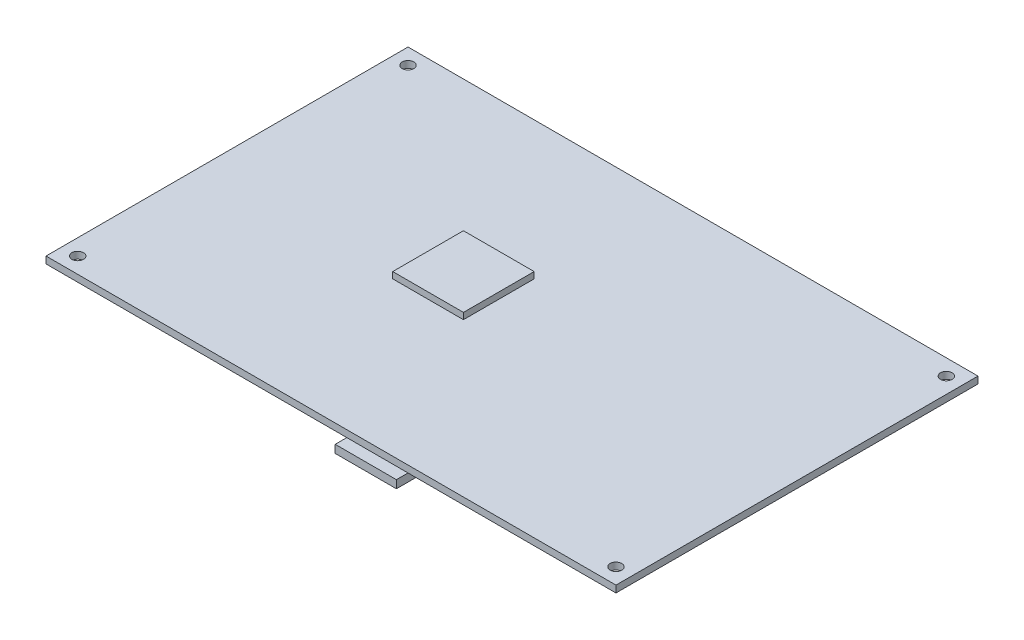
ISO-10303-21;
HEADER;
FILE_DESCRIPTION(('STEP AP214'),'2;1');
FILE_NAME('part.step','',(''),(''),'','','');
FILE_SCHEMA(('AUTOMOTIVE_DESIGN { 1 0 10303 214 1 1 1 1 }'));
ENDSEC;
DATA;
#1=APPLICATION_CONTEXT('core data for automotive mechanical design processes');
#2=APPLICATION_PROTOCOL_DEFINITION('international standard','automotive_design',2000,#1);
#3=PRODUCT_CONTEXT('',#1,'mechanical');
#4=PRODUCT('Part','Part','',(#3));
#5=PRODUCT_RELATED_PRODUCT_CATEGORY('part','',(#4));
#6=PRODUCT_DEFINITION_FORMATION('','',#4);
#7=PRODUCT_DEFINITION_CONTEXT('part definition',#1,'design');
#8=PRODUCT_DEFINITION('design','',#6,#7);
#9=PRODUCT_DEFINITION_SHAPE('','',#8);
#10=(LENGTH_UNIT() NAMED_UNIT(*) SI_UNIT(.MILLI.,.METRE.));
#11=(NAMED_UNIT(*) PLANE_ANGLE_UNIT() SI_UNIT($,.RADIAN.));
#12=(NAMED_UNIT(*) SI_UNIT($,.STERADIAN.) SOLID_ANGLE_UNIT());
#13=UNCERTAINTY_MEASURE_WITH_UNIT(LENGTH_MEASURE(1.E-05),#10,'distance_accuracy_value','');
#14=(GEOMETRIC_REPRESENTATION_CONTEXT(3) GLOBAL_UNCERTAINTY_ASSIGNED_CONTEXT((#13)) GLOBAL_UNIT_ASSIGNED_CONTEXT((#10,
#11,#12)) REPRESENTATION_CONTEXT('',''));
#15=CARTESIAN_POINT('',(0.,0.,0.));
#16=DIRECTION('',(0.,0.,1.));
#17=DIRECTION('',(1.,0.,0.));
#18=AXIS2_PLACEMENT_3D('',#15,#16,#17);
#19=CARTESIAN_POINT('',(0.,1.651,0.));
#20=DIRECTION('',(0.,1.,0.));
#21=DIRECTION('',(0.,0.,1.));
#22=AXIS2_PLACEMENT_3D('',#19,#20,#21);
#23=PLANE('',#22);
#24=CARTESIAN_POINT('',(-3.81,1.651,-83.312));
#25=DIRECTION('',(0.,1.,0.));
#26=DIRECTION('',(0.,0.,1.));
#27=AXIS2_PLACEMENT_3D('',#24,#25,#26);
#28=CIRCLE('',#27,1.39700000000001);
#29=CARTESIAN_POINT('',(-3.81,1.651,-84.709));
#30=VERTEX_POINT('',#29);
#31=EDGE_CURVE('E219',#30,#30,#28,.T.);
#32=ORIENTED_EDGE('',*,*,#31,.F.);
#33=EDGE_LOOP('',(#32));
#34=FACE_BOUND('',#33,.T.);
#35=CARTESIAN_POINT('',(-133.35,1.651,-83.312));
#36=DIRECTION('',(0.,1.,0.));
#37=DIRECTION('',(0.,0.,1.));
#38=AXIS2_PLACEMENT_3D('',#35,#36,#37);
#39=CIRCLE('',#38,1.39700000000002);
#40=CARTESIAN_POINT('',(-133.35,1.651,-84.709));
#41=VERTEX_POINT('',#40);
#42=EDGE_CURVE('E235',#41,#41,#39,.T.);
#43=ORIENTED_EDGE('',*,*,#42,.F.);
#44=EDGE_LOOP('',(#43));
#45=FACE_BOUND('',#44,.T.);
#46=DIRECTION('',(0.,0.,-1.));
#47=VECTOR('',#46,1.);
#48=CARTESIAN_POINT('',(0.,1.651,0.));
#49=LINE('',#48,#47);
#50=CARTESIAN_POINT('',(0.,1.651,0.));
#51=VERTEX_POINT('',#50);
#52=CARTESIAN_POINT('',(0.,1.651,-87.122));
#53=VERTEX_POINT('',#52);
#54=EDGE_CURVE('E243',#51,#53,#49,.T.);
#55=ORIENTED_EDGE('',*,*,#54,.T.);
#56=DIRECTION('',(-1.,0.,0.));
#57=VECTOR('',#56,1.);
#58=CARTESIAN_POINT('',(0.,1.651,-87.122));
#59=LINE('',#58,#57);
#60=CARTESIAN_POINT('',(-137.16,1.651,-87.122));
#61=VERTEX_POINT('',#60);
#62=EDGE_CURVE('E247',#53,#61,#59,.T.);
#63=ORIENTED_EDGE('',*,*,#62,.T.);
#64=DIRECTION('',(0.,0.,1.));
#65=VECTOR('',#64,1.);
#66=CARTESIAN_POINT('',(-137.16,1.651,0.));
#67=LINE('',#66,#65);
#68=CARTESIAN_POINT('',(-137.16,1.651,0.));
#69=VERTEX_POINT('',#68);
#70=EDGE_CURVE('E251',#61,#69,#67,.T.);
#71=ORIENTED_EDGE('',*,*,#70,.T.);
#72=DIRECTION('',(1.,0.,0.));
#73=VECTOR('',#72,1.);
#74=CARTESIAN_POINT('',(0.,1.651,0.));
#75=LINE('',#74,#73);
#76=EDGE_CURVE('E254',#69,#51,#75,.T.);
#77=ORIENTED_EDGE('',*,*,#76,.T.);
#78=EDGE_LOOP('',(#55,#63,#71,#77));
#79=FACE_BOUND('',#78,.T.);
#80=CARTESIAN_POINT('',(-3.81,1.651,-3.81));
#81=DIRECTION('',(0.,1.,0.));
#82=DIRECTION('',(0.,0.,1.));
#83=AXIS2_PLACEMENT_3D('',#80,#81,#82);
#84=CIRCLE('',#83,1.397);
#85=CARTESIAN_POINT('',(-3.81,1.651,-5.207));
#86=VERTEX_POINT('',#85);
#87=EDGE_CURVE('E227',#86,#86,#84,.T.);
#88=ORIENTED_EDGE('',*,*,#87,.F.);
#89=EDGE_LOOP('',(#88));
#90=FACE_BOUND('',#89,.T.);
#91=CARTESIAN_POINT('',(-133.35,1.651,-3.80999999999998));
#92=DIRECTION('',(0.,1.,0.));
#93=DIRECTION('',(0.,0.,1.));
#94=AXIS2_PLACEMENT_3D('',#91,#92,#93);
#95=CIRCLE('',#94,1.39699999999999);
#96=CARTESIAN_POINT('',(-133.35,1.651,-5.20699999999997));
#97=VERTEX_POINT('',#96);
#98=EDGE_CURVE('E211',#97,#97,#95,.T.);
#99=ORIENTED_EDGE('',*,*,#98,.F.);
#100=EDGE_LOOP('',(#99));
#101=FACE_BOUND('',#100,.T.);
#102=DIRECTION('',(1.,0.,0.));
#103=VECTOR('',#102,1.);
#104=CARTESIAN_POINT('',(-90.678,1.651,-36.957));
#105=LINE('',#104,#103);
#106=CARTESIAN_POINT('',(-90.678,1.651,-36.957));
#107=VERTEX_POINT('',#106);
#108=CARTESIAN_POINT('',(-73.66,1.651,-36.957));
#109=VERTEX_POINT('',#108);
#110=EDGE_CURVE('E313',#107,#109,#105,.T.);
#111=ORIENTED_EDGE('',*,*,#110,.F.);
#112=DIRECTION('',(0.,0.,1.));
#113=VECTOR('',#112,1.);
#114=CARTESIAN_POINT('',(-90.678,1.651,-36.957));
#115=LINE('',#114,#113);
#116=CARTESIAN_POINT('',(-90.678,1.651,-53.975));
#117=VERTEX_POINT('',#116);
#118=EDGE_CURVE('E161',#117,#107,#115,.T.);
#119=ORIENTED_EDGE('',*,*,#118,.F.);
#120=DIRECTION('',(-1.,0.,0.));
#121=VECTOR('',#120,1.);
#122=CARTESIAN_POINT('',(-90.678,1.651,-53.975));
#123=LINE('',#122,#121);
#124=CARTESIAN_POINT('',(-73.66,1.651,-53.975));
#125=VERTEX_POINT('',#124);
#126=EDGE_CURVE('E157',#125,#117,#123,.T.);
#127=ORIENTED_EDGE('',*,*,#126,.F.);
#128=DIRECTION('',(0.,0.,-1.));
#129=VECTOR('',#128,1.);
#130=CARTESIAN_POINT('',(-73.66,1.651,-36.957));
#131=LINE('',#130,#129);
#132=EDGE_CURVE('E315',#109,#125,#131,.T.);
#133=ORIENTED_EDGE('',*,*,#132,.F.);
#134=EDGE_LOOP('',(#111,#119,#127,#133));
#135=FACE_BOUND('',#134,.T.);
#136=ADVANCED_FACE('F39',(#34,#45,#79,#90,#101,#135),#23,.T.);
#137=CARTESIAN_POINT('',(0.,0.,0.));
#138=DIRECTION('',(0.,1.,0.));
#139=DIRECTION('',(0.,0.,1.));
#140=AXIS2_PLACEMENT_3D('',#137,#138,#139);
#141=PLANE('',#140);
#142=CARTESIAN_POINT('',(-133.35,0.,-3.80999999999998));
#143=DIRECTION('',(0.,1.,0.));
#144=DIRECTION('',(0.,0.,1.));
#145=AXIS2_PLACEMENT_3D('',#142,#143,#144);
#146=CIRCLE('',#145,1.39699999999999);
#147=CARTESIAN_POINT('',(-133.35,0.,-5.20699999999997));
#148=VERTEX_POINT('',#147);
#149=EDGE_CURVE('E210',#148,#148,#146,.T.);
#150=ORIENTED_EDGE('',*,*,#149,.T.);
#151=EDGE_LOOP('',(#150));
#152=FACE_BOUND('',#151,.T.);
#153=CARTESIAN_POINT('',(-3.81,0.,-83.312));
#154=DIRECTION('',(0.,1.,0.));
#155=DIRECTION('',(0.,0.,1.));
#156=AXIS2_PLACEMENT_3D('',#153,#154,#155);
#157=CIRCLE('',#156,1.39700000000001);
#158=CARTESIAN_POINT('',(-3.81,0.,-84.709));
#159=VERTEX_POINT('',#158);
#160=EDGE_CURVE('E215',#159,#159,#157,.T.);
#161=ORIENTED_EDGE('',*,*,#160,.T.);
#162=EDGE_LOOP('',(#161));
#163=FACE_BOUND('',#162,.T.);
#164=CARTESIAN_POINT('',(-3.81,0.,-3.81));
#165=DIRECTION('',(0.,1.,0.));
#166=DIRECTION('',(0.,0.,1.));
#167=AXIS2_PLACEMENT_3D('',#164,#165,#166);
#168=CIRCLE('',#167,1.397);
#169=CARTESIAN_POINT('',(-3.81,0.,-5.207));
#170=VERTEX_POINT('',#169);
#171=EDGE_CURVE('E223',#170,#170,#168,.T.);
#172=ORIENTED_EDGE('',*,*,#171,.T.);
#173=EDGE_LOOP('',(#172));
#174=FACE_BOUND('',#173,.T.);
#175=CARTESIAN_POINT('',(-133.35,0.,-83.312));
#176=DIRECTION('',(0.,1.,0.));
#177=DIRECTION('',(0.,0.,1.));
#178=AXIS2_PLACEMENT_3D('',#175,#176,#177);
#179=CIRCLE('',#178,1.39700000000002);
#180=CARTESIAN_POINT('',(-133.35,0.,-84.709));
#181=VERTEX_POINT('',#180);
#182=EDGE_CURVE('E231',#181,#181,#179,.T.);
#183=ORIENTED_EDGE('',*,*,#182,.T.);
#184=EDGE_LOOP('',(#183));
#185=FACE_BOUND('',#184,.T.);
#186=DIRECTION('',(0.,0.,-1.));
#187=VECTOR('',#186,1.);
#188=CARTESIAN_POINT('',(-64.77,0.,-11.7348));
#189=LINE('',#188,#187);
#190=CARTESIAN_POINT('',(-64.77,0.,0.));
#191=VERTEX_POINT('',#190);
#192=CARTESIAN_POINT('',(-64.77,0.,-11.7348));
#193=VERTEX_POINT('',#192);
#194=EDGE_CURVE('E11',#191,#193,#189,.T.);
#195=ORIENTED_EDGE('',*,*,#194,.F.);
#196=DIRECTION('',(1.,0.,0.));
#197=VECTOR('',#196,1.);
#198=CARTESIAN_POINT('',(0.,0.,0.));
#199=LINE('',#198,#197);
#200=CARTESIAN_POINT('',(-137.16,0.,0.));
#201=VERTEX_POINT('',#200);
#202=EDGE_CURVE('E248',#201,#191,#199,.T.);
#203=ORIENTED_EDGE('',*,*,#202,.F.);
#204=DIRECTION('',(0.,0.,1.));
#205=VECTOR('',#204,1.);
#206=CARTESIAN_POINT('',(-137.16,0.,0.));
#207=LINE('',#206,#205);
#208=CARTESIAN_POINT('',(-137.16,0.,-87.122));
#209=VERTEX_POINT('',#208);
#210=EDGE_CURVE('E264',#209,#201,#207,.T.);
#211=ORIENTED_EDGE('',*,*,#210,.F.);
#212=DIRECTION('',(-1.,0.,0.));
#213=VECTOR('',#212,1.);
#214=CARTESIAN_POINT('',(0.,0.,-87.122));
#215=LINE('',#214,#213);
#216=CARTESIAN_POINT('',(0.,0.,-87.122));
#217=VERTEX_POINT('',#216);
#218=EDGE_CURVE('E261',#217,#209,#215,.T.);
#219=ORIENTED_EDGE('',*,*,#218,.F.);
#220=DIRECTION('',(0.,0.,-1.));
#221=VECTOR('',#220,1.);
#222=CARTESIAN_POINT('',(0.,0.,0.));
#223=LINE('',#222,#221);
#224=CARTESIAN_POINT('',(0.,0.,0.));
#225=VERTEX_POINT('',#224);
#226=EDGE_CURVE('E239',#225,#217,#223,.T.);
#227=ORIENTED_EDGE('',*,*,#226,.F.);
#228=CARTESIAN_POINT('',(-50.038,0.,0.));
#229=VERTEX_POINT('',#228);
#230=EDGE_CURVE('E267',#229,#225,#199,.T.);
#231=ORIENTED_EDGE('',*,*,#230,.F.);
#232=DIRECTION('',(0.,0.,1.));
#233=VECTOR('',#232,1.);
#234=CARTESIAN_POINT('',(-50.038,0.,-11.7348));
#235=LINE('',#234,#233);
#236=CARTESIAN_POINT('',(-50.038,0.,-11.7348));
#237=VERTEX_POINT('',#236);
#238=EDGE_CURVE('E189',#237,#229,#235,.T.);
#239=ORIENTED_EDGE('',*,*,#238,.F.);
#240=DIRECTION('',(1.,0.,0.));
#241=VECTOR('',#240,1.);
#242=CARTESIAN_POINT('',(-64.77,0.,-11.7348));
#243=LINE('',#242,#241);
#244=EDGE_CURVE('E65',#193,#237,#243,.T.);
#245=ORIENTED_EDGE('',*,*,#244,.F.);
#246=EDGE_LOOP('',(#195,#203,#211,#219,#227,#231,#239,#245));
#247=FACE_BOUND('',#246,.T.);
#248=ADVANCED_FACE('F294',(#152,#163,#174,#185,#247),#141,.F.);
#249=CARTESIAN_POINT('',(0.,1.651,0.));
#250=DIRECTION('',(-1.,0.,0.));
#251=DIRECTION('',(0.,0.,1.));
#252=AXIS2_PLACEMENT_3D('',#249,#250,#251);
#253=PLANE('',#252);
#254=ORIENTED_EDGE('',*,*,#226,.T.);
#255=DIRECTION('',(0.,-1.,0.));
#256=VECTOR('',#255,1.);
#257=CARTESIAN_POINT('',(0.,1.651,-87.122));
#258=LINE('',#257,#256);
#259=EDGE_CURVE('E43',#53,#217,#258,.T.);
#260=ORIENTED_EDGE('',*,*,#259,.F.);
#261=ORIENTED_EDGE('',*,*,#54,.F.);
#262=DIRECTION('',(0.,-1.,0.));
#263=VECTOR('',#262,1.);
#264=CARTESIAN_POINT('',(0.,1.651,0.));
#265=LINE('',#264,#263);
#266=EDGE_CURVE('E257',#51,#225,#265,.T.);
#267=ORIENTED_EDGE('',*,*,#266,.T.);
#268=EDGE_LOOP('',(#254,#260,#261,#267));
#269=FACE_BOUND('',#268,.T.);
#270=ADVANCED_FACE('F41',(#269),#253,.F.);
#271=CARTESIAN_POINT('',(0.,1.651,-87.122));
#272=DIRECTION('',(0.,0.,1.));
#273=DIRECTION('',(1.,0.,0.));
#274=AXIS2_PLACEMENT_3D('',#271,#272,#273);
#275=PLANE('',#274);
#276=ORIENTED_EDGE('',*,*,#218,.T.);
#277=DIRECTION('',(0.,-1.,0.));
#278=VECTOR('',#277,1.);
#279=CARTESIAN_POINT('',(-137.16,1.651,-87.122));
#280=LINE('',#279,#278);
#281=EDGE_CURVE('E278',#61,#209,#280,.T.);
#282=ORIENTED_EDGE('',*,*,#281,.F.);
#283=ORIENTED_EDGE('',*,*,#62,.F.);
#284=ORIENTED_EDGE('',*,*,#259,.T.);
#285=EDGE_LOOP('',(#276,#282,#283,#284));
#286=FACE_BOUND('',#285,.T.);
#287=ADVANCED_FACE('F289',(#286),#275,.F.);
#288=CARTESIAN_POINT('',(-137.16,1.651,0.));
#289=DIRECTION('',(1.,0.,0.));
#290=DIRECTION('',(0.,0.,-1.));
#291=AXIS2_PLACEMENT_3D('',#288,#289,#290);
#292=PLANE('',#291);
#293=ORIENTED_EDGE('',*,*,#210,.T.);
#294=DIRECTION('',(0.,-1.,0.));
#295=VECTOR('',#294,1.);
#296=CARTESIAN_POINT('',(-137.16,1.651,0.));
#297=LINE('',#296,#295);
#298=EDGE_CURVE('E275',#69,#201,#297,.T.);
#299=ORIENTED_EDGE('',*,*,#298,.F.);
#300=ORIENTED_EDGE('',*,*,#70,.F.);
#301=ORIENTED_EDGE('',*,*,#281,.T.);
#302=EDGE_LOOP('',(#293,#299,#300,#301));
#303=FACE_BOUND('',#302,.T.);
#304=ADVANCED_FACE('F298',(#303),#292,.F.);
#305=CARTESIAN_POINT('',(0.,1.651,0.));
#306=DIRECTION('',(0.,0.,-1.));
#307=DIRECTION('',(-1.,0.,0.));
#308=AXIS2_PLACEMENT_3D('',#305,#306,#307);
#309=PLANE('',#308);
#310=ORIENTED_EDGE('',*,*,#202,.T.);
#311=EDGE_CURVE('E271',#191,#229,#199,.T.);
#312=ORIENTED_EDGE('',*,*,#311,.T.);
#313=ORIENTED_EDGE('',*,*,#230,.T.);
#314=ORIENTED_EDGE('',*,*,#266,.F.);
#315=ORIENTED_EDGE('',*,*,#76,.F.);
#316=ORIENTED_EDGE('',*,*,#298,.T.);
#317=EDGE_LOOP('',(#310,#312,#313,#314,#315,#316));
#318=FACE_BOUND('',#317,.T.);
#319=ADVANCED_FACE('F301',(#318),#309,.F.);
#320=CARTESIAN_POINT('',(-133.35,1.651,-83.312));
#321=DIRECTION('',(0.,-1.,0.));
#322=DIRECTION('',(0.,0.,-1.));
#323=AXIS2_PLACEMENT_3D('',#320,#321,#322);
#324=CYLINDRICAL_SURFACE('',#323,1.39700000000002);
#325=CARTESIAN_POINT('',(-133.35,1.651,-84.709));
#326=CARTESIAN_POINT('',(-133.35,1.63380208333333,-84.709));
#327=CARTESIAN_POINT('',(-133.35,1.61660416666667,-84.709));
#328=CARTESIAN_POINT('',(-133.35,1.58220833333333,-84.709));
#329=CARTESIAN_POINT('',(-133.35,1.56501041666667,-84.709));
#330=CARTESIAN_POINT('',(-133.35,1.53061458333333,-84.709));
#331=CARTESIAN_POINT('',(-133.35,1.51341666666667,-84.709));
#332=CARTESIAN_POINT('',(-133.35,1.47902083333333,-84.709));
#333=CARTESIAN_POINT('',(-133.35,1.46182291666667,-84.709));
#334=CARTESIAN_POINT('',(-133.35,1.42742708333333,-84.709));
#335=CARTESIAN_POINT('',(-133.35,1.41022916666667,-84.709));
#336=CARTESIAN_POINT('',(-133.35,1.37583333333333,-84.709));
#337=CARTESIAN_POINT('',(-133.35,1.35863541666667,-84.709));
#338=CARTESIAN_POINT('',(-133.35,1.32423958333333,-84.709));
#339=CARTESIAN_POINT('',(-133.35,1.30704166666667,-84.709));
#340=CARTESIAN_POINT('',(-133.35,1.27264583333333,-84.709));
#341=CARTESIAN_POINT('',(-133.35,1.25544791666667,-84.709));
#342=CARTESIAN_POINT('',(-133.35,1.22105208333333,-84.709));
#343=CARTESIAN_POINT('',(-133.35,1.20385416666667,-84.709));
#344=CARTESIAN_POINT('',(-133.35,1.16945833333333,-84.709));
#345=CARTESIAN_POINT('',(-133.35,1.15226041666667,-84.709));
#346=CARTESIAN_POINT('',(-133.35,1.11786458333333,-84.709));
#347=CARTESIAN_POINT('',(-133.35,1.10066666666667,-84.709));
#348=CARTESIAN_POINT('',(-133.35,1.06627083333333,-84.709));
#349=CARTESIAN_POINT('',(-133.35,1.04907291666667,-84.709));
#350=CARTESIAN_POINT('',(-133.35,1.01467708333333,-84.709));
#351=CARTESIAN_POINT('',(-133.35,0.997479166666666,-84.709));
#352=CARTESIAN_POINT('',(-133.35,0.963083333333333,-84.709));
#353=CARTESIAN_POINT('',(-133.35,0.945885416666667,-84.709));
#354=CARTESIAN_POINT('',(-133.35,0.911489583333333,-84.709));
#355=CARTESIAN_POINT('',(-133.35,0.894291666666667,-84.709));
#356=CARTESIAN_POINT('',(-133.35,0.859895833333333,-84.709));
#357=CARTESIAN_POINT('',(-133.35,0.842697916666667,-84.709));
#358=CARTESIAN_POINT('',(-133.35,0.808302083333333,-84.709));
#359=CARTESIAN_POINT('',(-133.35,0.791104166666667,-84.709));
#360=CARTESIAN_POINT('',(-133.35,0.756708333333333,-84.709));
#361=CARTESIAN_POINT('',(-133.35,0.739510416666667,-84.709));
#362=CARTESIAN_POINT('',(-133.35,0.705114583333333,-84.709));
#363=CARTESIAN_POINT('',(-133.35,0.687916666666667,-84.709));
#364=CARTESIAN_POINT('',(-133.35,0.653520833333333,-84.709));
#365=CARTESIAN_POINT('',(-133.35,0.636322916666667,-84.709));
#366=CARTESIAN_POINT('',(-133.35,0.601927083333333,-84.709));
#367=CARTESIAN_POINT('',(-133.35,0.584729166666667,-84.709));
#368=CARTESIAN_POINT('',(-133.35,0.550333333333333,-84.709));
#369=CARTESIAN_POINT('',(-133.35,0.533135416666667,-84.709));
#370=CARTESIAN_POINT('',(-133.35,0.498739583333333,-84.709));
#371=CARTESIAN_POINT('',(-133.35,0.481541666666667,-84.709));
#372=CARTESIAN_POINT('',(-133.35,0.447145833333333,-84.709));
#373=CARTESIAN_POINT('',(-133.35,0.429947916666667,-84.709));
#374=CARTESIAN_POINT('',(-133.35,0.395552083333333,-84.709));
#375=CARTESIAN_POINT('',(-133.35,0.378354166666667,-84.709));
#376=CARTESIAN_POINT('',(-133.35,0.343958333333333,-84.709));
#377=CARTESIAN_POINT('',(-133.35,0.326760416666667,-84.709));
#378=CARTESIAN_POINT('',(-133.35,0.292364583333333,-84.709));
#379=CARTESIAN_POINT('',(-133.35,0.275166666666667,-84.709));
#380=CARTESIAN_POINT('',(-133.35,0.240770833333333,-84.709));
#381=CARTESIAN_POINT('',(-133.35,0.223572916666667,-84.709));
#382=CARTESIAN_POINT('',(-133.35,0.189177083333333,-84.709));
#383=CARTESIAN_POINT('',(-133.35,0.171979166666667,-84.709));
#384=CARTESIAN_POINT('',(-133.35,0.137583333333333,-84.709));
#385=CARTESIAN_POINT('',(-133.35,0.120385416666667,-84.709));
#386=CARTESIAN_POINT('',(-133.35,0.0859895833333333,-84.709));
#387=CARTESIAN_POINT('',(-133.35,0.0687916666666667,-84.709));
#388=CARTESIAN_POINT('',(-133.35,0.0343958333333333,-84.709));
#389=CARTESIAN_POINT('',(-133.35,0.0171979166666666,-84.709));
#390=CARTESIAN_POINT('',(-133.35,0.,-84.709));
#391=B_SPLINE_CURVE_WITH_KNOTS('',3,(#325,#326,#327,#328,#329,#330,#331,#332,#333,#334,#335,
#336,#337,#338,#339,#340,#341,#342,#343,#344,#345,#346,#347,#348,#349,#350,#351,#352,#353,#354,
#355,#356,#357,#358,#359,#360,#361,#362,#363,#364,#365,#366,#367,#368,#369,#370,#371,#372,#373,
#374,#375,#376,#377,#378,#379,#380,#381,#382,#383,#384,#385,#386,#387,#388,#389,#390),
.UNSPECIFIED.,.F.,.F.,(4,2,2,2,2,2,2,2,2,2,2,2,2,2,2,2,2,2,2,2,2,2,2,2,2,2,2,2,2,2,2,2,4),(0.,
0.05159375,0.1031875,0.15478125,0.206375,0.25796875,0.3095625,0.36115625,0.41275,0.46434375,
0.5159375,0.56753125,0.619125,0.67071875,0.7223125,0.77390625,0.8255,0.87709375,0.9286875,
0.98028125,1.031875,1.08346875,1.1350625,1.18665625,1.23825,1.28984375,1.3414375,1.39303125,
1.444625,1.49621875,1.5478125,1.59940625,1.651),.UNSPECIFIED.);
#392=EDGE_CURVE('BSEAM383',#41,#181,#391,.T.);
#393=ORIENTED_EDGE('',*,*,#42,.T.);
#394=ORIENTED_EDGE('',*,*,#182,.F.);
#395=ORIENTED_EDGE('',*,*,#392,.T.);
#396=ORIENTED_EDGE('',*,*,#392,.F.);
#397=EDGE_LOOP('',(#393,#395,#394,#396));
#398=FACE_BOUND('',#397,.T.);
#399=ADVANCED_FACE('F383',(#398),#324,.F.);
#400=CARTESIAN_POINT('',(-3.81,1.651,-3.81));
#401=DIRECTION('',(0.,-1.,0.));
#402=DIRECTION('',(0.,0.,-1.));
#403=AXIS2_PLACEMENT_3D('',#400,#401,#402);
#404=CYLINDRICAL_SURFACE('',#403,1.397);
#405=CARTESIAN_POINT('',(-3.81,1.651,-5.207));
#406=CARTESIAN_POINT('',(-3.81,1.63380208333333,-5.207));
#407=CARTESIAN_POINT('',(-3.81,1.61660416666667,-5.207));
#408=CARTESIAN_POINT('',(-3.81,1.58220833333333,-5.207));
#409=CARTESIAN_POINT('',(-3.81,1.56501041666667,-5.207));
#410=CARTESIAN_POINT('',(-3.81,1.53061458333333,-5.207));
#411=CARTESIAN_POINT('',(-3.81,1.51341666666667,-5.207));
#412=CARTESIAN_POINT('',(-3.81,1.47902083333333,-5.207));
#413=CARTESIAN_POINT('',(-3.81,1.46182291666667,-5.207));
#414=CARTESIAN_POINT('',(-3.81,1.42742708333333,-5.207));
#415=CARTESIAN_POINT('',(-3.81,1.41022916666667,-5.207));
#416=CARTESIAN_POINT('',(-3.81,1.37583333333333,-5.207));
#417=CARTESIAN_POINT('',(-3.81,1.35863541666667,-5.207));
#418=CARTESIAN_POINT('',(-3.81,1.32423958333333,-5.207));
#419=CARTESIAN_POINT('',(-3.81,1.30704166666667,-5.207));
#420=CARTESIAN_POINT('',(-3.81,1.27264583333333,-5.207));
#421=CARTESIAN_POINT('',(-3.81,1.25544791666667,-5.207));
#422=CARTESIAN_POINT('',(-3.81,1.22105208333333,-5.207));
#423=CARTESIAN_POINT('',(-3.81,1.20385416666667,-5.207));
#424=CARTESIAN_POINT('',(-3.81,1.16945833333333,-5.207));
#425=CARTESIAN_POINT('',(-3.81,1.15226041666667,-5.207));
#426=CARTESIAN_POINT('',(-3.81,1.11786458333333,-5.207));
#427=CARTESIAN_POINT('',(-3.81,1.10066666666667,-5.207));
#428=CARTESIAN_POINT('',(-3.81,1.06627083333333,-5.207));
#429=CARTESIAN_POINT('',(-3.81,1.04907291666667,-5.207));
#430=CARTESIAN_POINT('',(-3.81,1.01467708333333,-5.207));
#431=CARTESIAN_POINT('',(-3.81,0.997479166666666,-5.207));
#432=CARTESIAN_POINT('',(-3.81,0.963083333333333,-5.207));
#433=CARTESIAN_POINT('',(-3.81,0.945885416666667,-5.207));
#434=CARTESIAN_POINT('',(-3.81,0.911489583333333,-5.207));
#435=CARTESIAN_POINT('',(-3.81,0.894291666666667,-5.207));
#436=CARTESIAN_POINT('',(-3.81,0.859895833333333,-5.207));
#437=CARTESIAN_POINT('',(-3.81,0.842697916666667,-5.207));
#438=CARTESIAN_POINT('',(-3.81,0.808302083333333,-5.207));
#439=CARTESIAN_POINT('',(-3.81,0.791104166666667,-5.207));
#440=CARTESIAN_POINT('',(-3.81,0.756708333333333,-5.207));
#441=CARTESIAN_POINT('',(-3.81,0.739510416666667,-5.207));
#442=CARTESIAN_POINT('',(-3.81,0.705114583333333,-5.207));
#443=CARTESIAN_POINT('',(-3.81,0.687916666666667,-5.207));
#444=CARTESIAN_POINT('',(-3.81,0.653520833333333,-5.207));
#445=CARTESIAN_POINT('',(-3.81,0.636322916666667,-5.207));
#446=CARTESIAN_POINT('',(-3.81,0.601927083333333,-5.207));
#447=CARTESIAN_POINT('',(-3.81,0.584729166666667,-5.207));
#448=CARTESIAN_POINT('',(-3.81,0.550333333333333,-5.207));
#449=CARTESIAN_POINT('',(-3.81,0.533135416666667,-5.207));
#450=CARTESIAN_POINT('',(-3.81,0.498739583333333,-5.207));
#451=CARTESIAN_POINT('',(-3.81,0.481541666666667,-5.207));
#452=CARTESIAN_POINT('',(-3.81,0.447145833333333,-5.207));
#453=CARTESIAN_POINT('',(-3.81,0.429947916666667,-5.207));
#454=CARTESIAN_POINT('',(-3.81,0.395552083333333,-5.207));
#455=CARTESIAN_POINT('',(-3.81,0.378354166666667,-5.207));
#456=CARTESIAN_POINT('',(-3.81,0.343958333333333,-5.207));
#457=CARTESIAN_POINT('',(-3.81,0.326760416666667,-5.207));
#458=CARTESIAN_POINT('',(-3.81,0.292364583333333,-5.207));
#459=CARTESIAN_POINT('',(-3.81,0.275166666666667,-5.207));
#460=CARTESIAN_POINT('',(-3.81,0.240770833333333,-5.207));
#461=CARTESIAN_POINT('',(-3.81,0.223572916666667,-5.207));
#462=CARTESIAN_POINT('',(-3.81,0.189177083333333,-5.207));
#463=CARTESIAN_POINT('',(-3.81,0.171979166666667,-5.207));
#464=CARTESIAN_POINT('',(-3.81,0.137583333333333,-5.207));
#465=CARTESIAN_POINT('',(-3.81,0.120385416666667,-5.207));
#466=CARTESIAN_POINT('',(-3.81,0.0859895833333333,-5.207));
#467=CARTESIAN_POINT('',(-3.81,0.0687916666666667,-5.207));
#468=CARTESIAN_POINT('',(-3.81,0.0343958333333333,-5.207));
#469=CARTESIAN_POINT('',(-3.81,0.0171979166666666,-5.207));
#470=CARTESIAN_POINT('',(-3.81,0.,-5.207));
#471=B_SPLINE_CURVE_WITH_KNOTS('',3,(#405,#406,#407,#408,#409,#410,#411,#412,#413,#414,#415,
#416,#417,#418,#419,#420,#421,#422,#423,#424,#425,#426,#427,#428,#429,#430,#431,#432,#433,#434,
#435,#436,#437,#438,#439,#440,#441,#442,#443,#444,#445,#446,#447,#448,#449,#450,#451,#452,#453,
#454,#455,#456,#457,#458,#459,#460,#461,#462,#463,#464,#465,#466,#467,#468,#469,#470),
.UNSPECIFIED.,.F.,.F.,(4,2,2,2,2,2,2,2,2,2,2,2,2,2,2,2,2,2,2,2,2,2,2,2,2,2,2,2,2,2,2,2,4),(0.,
0.05159375,0.1031875,0.15478125,0.206375,0.25796875,0.3095625,0.36115625,0.41275,0.46434375,
0.5159375,0.56753125,0.619125,0.67071875,0.7223125,0.77390625,0.8255,0.87709375,0.9286875,
0.98028125,1.031875,1.08346875,1.1350625,1.18665625,1.23825,1.28984375,1.3414375,1.39303125,
1.444625,1.49621875,1.5478125,1.59940625,1.651),.UNSPECIFIED.);
#472=EDGE_CURVE('BSEAM379',#86,#170,#471,.T.);
#473=ORIENTED_EDGE('',*,*,#87,.T.);
#474=ORIENTED_EDGE('',*,*,#171,.F.);
#475=ORIENTED_EDGE('',*,*,#472,.T.);
#476=ORIENTED_EDGE('',*,*,#472,.F.);
#477=EDGE_LOOP('',(#473,#475,#474,#476));
#478=FACE_BOUND('',#477,.T.);
#479=ADVANCED_FACE('F379',(#478),#404,.F.);
#480=CARTESIAN_POINT('',(-3.81,1.651,-83.312));
#481=DIRECTION('',(0.,-1.,0.));
#482=DIRECTION('',(0.,0.,-1.));
#483=AXIS2_PLACEMENT_3D('',#480,#481,#482);
#484=CYLINDRICAL_SURFACE('',#483,1.39700000000001);
#485=CARTESIAN_POINT('',(-3.81,1.651,-84.709));
#486=CARTESIAN_POINT('',(-3.81,1.63380208333333,-84.709));
#487=CARTESIAN_POINT('',(-3.81,1.61660416666667,-84.709));
#488=CARTESIAN_POINT('',(-3.81,1.58220833333333,-84.709));
#489=CARTESIAN_POINT('',(-3.81,1.56501041666667,-84.709));
#490=CARTESIAN_POINT('',(-3.81,1.53061458333333,-84.709));
#491=CARTESIAN_POINT('',(-3.81,1.51341666666667,-84.709));
#492=CARTESIAN_POINT('',(-3.81,1.47902083333333,-84.709));
#493=CARTESIAN_POINT('',(-3.81,1.46182291666667,-84.709));
#494=CARTESIAN_POINT('',(-3.81,1.42742708333333,-84.709));
#495=CARTESIAN_POINT('',(-3.81,1.41022916666667,-84.709));
#496=CARTESIAN_POINT('',(-3.81,1.37583333333333,-84.709));
#497=CARTESIAN_POINT('',(-3.81,1.35863541666667,-84.709));
#498=CARTESIAN_POINT('',(-3.81,1.32423958333333,-84.709));
#499=CARTESIAN_POINT('',(-3.81,1.30704166666667,-84.709));
#500=CARTESIAN_POINT('',(-3.81,1.27264583333333,-84.709));
#501=CARTESIAN_POINT('',(-3.81,1.25544791666667,-84.709));
#502=CARTESIAN_POINT('',(-3.81,1.22105208333333,-84.709));
#503=CARTESIAN_POINT('',(-3.81,1.20385416666667,-84.709));
#504=CARTESIAN_POINT('',(-3.81,1.16945833333333,-84.709));
#505=CARTESIAN_POINT('',(-3.81,1.15226041666667,-84.709));
#506=CARTESIAN_POINT('',(-3.81,1.11786458333333,-84.709));
#507=CARTESIAN_POINT('',(-3.81,1.10066666666667,-84.709));
#508=CARTESIAN_POINT('',(-3.81,1.06627083333333,-84.709));
#509=CARTESIAN_POINT('',(-3.81,1.04907291666667,-84.709));
#510=CARTESIAN_POINT('',(-3.81,1.01467708333333,-84.709));
#511=CARTESIAN_POINT('',(-3.81,0.997479166666666,-84.709));
#512=CARTESIAN_POINT('',(-3.81,0.963083333333333,-84.709));
#513=CARTESIAN_POINT('',(-3.81,0.945885416666667,-84.709));
#514=CARTESIAN_POINT('',(-3.81,0.911489583333333,-84.709));
#515=CARTESIAN_POINT('',(-3.81,0.894291666666667,-84.709));
#516=CARTESIAN_POINT('',(-3.81,0.859895833333333,-84.709));
#517=CARTESIAN_POINT('',(-3.81,0.842697916666667,-84.709));
#518=CARTESIAN_POINT('',(-3.81,0.808302083333333,-84.709));
#519=CARTESIAN_POINT('',(-3.81,0.791104166666667,-84.709));
#520=CARTESIAN_POINT('',(-3.81,0.756708333333333,-84.709));
#521=CARTESIAN_POINT('',(-3.81,0.739510416666667,-84.709));
#522=CARTESIAN_POINT('',(-3.81,0.705114583333333,-84.709));
#523=CARTESIAN_POINT('',(-3.81,0.687916666666667,-84.709));
#524=CARTESIAN_POINT('',(-3.81,0.653520833333333,-84.709));
#525=CARTESIAN_POINT('',(-3.81,0.636322916666667,-84.709));
#526=CARTESIAN_POINT('',(-3.81,0.601927083333333,-84.709));
#527=CARTESIAN_POINT('',(-3.81,0.584729166666667,-84.709));
#528=CARTESIAN_POINT('',(-3.81,0.550333333333333,-84.709));
#529=CARTESIAN_POINT('',(-3.81,0.533135416666667,-84.709));
#530=CARTESIAN_POINT('',(-3.81,0.498739583333333,-84.709));
#531=CARTESIAN_POINT('',(-3.81,0.481541666666667,-84.709));
#532=CARTESIAN_POINT('',(-3.81,0.447145833333333,-84.709));
#533=CARTESIAN_POINT('',(-3.81,0.429947916666667,-84.709));
#534=CARTESIAN_POINT('',(-3.81,0.395552083333333,-84.709));
#535=CARTESIAN_POINT('',(-3.81,0.378354166666667,-84.709));
#536=CARTESIAN_POINT('',(-3.81,0.343958333333333,-84.709));
#537=CARTESIAN_POINT('',(-3.81,0.326760416666667,-84.709));
#538=CARTESIAN_POINT('',(-3.81,0.292364583333333,-84.709));
#539=CARTESIAN_POINT('',(-3.81,0.275166666666667,-84.709));
#540=CARTESIAN_POINT('',(-3.81,0.240770833333333,-84.709));
#541=CARTESIAN_POINT('',(-3.81,0.223572916666667,-84.709));
#542=CARTESIAN_POINT('',(-3.81,0.189177083333333,-84.709));
#543=CARTESIAN_POINT('',(-3.81,0.171979166666667,-84.709));
#544=CARTESIAN_POINT('',(-3.81,0.137583333333333,-84.709));
#545=CARTESIAN_POINT('',(-3.81,0.120385416666667,-84.709));
#546=CARTESIAN_POINT('',(-3.81,0.0859895833333333,-84.709));
#547=CARTESIAN_POINT('',(-3.81,0.0687916666666667,-84.709));
#548=CARTESIAN_POINT('',(-3.81,0.0343958333333333,-84.709));
#549=CARTESIAN_POINT('',(-3.81,0.0171979166666666,-84.709));
#550=CARTESIAN_POINT('',(-3.81,0.,-84.709));
#551=B_SPLINE_CURVE_WITH_KNOTS('',3,(#485,#486,#487,#488,#489,#490,#491,#492,#493,#494,#495,
#496,#497,#498,#499,#500,#501,#502,#503,#504,#505,#506,#507,#508,#509,#510,#511,#512,#513,#514,
#515,#516,#517,#518,#519,#520,#521,#522,#523,#524,#525,#526,#527,#528,#529,#530,#531,#532,#533,
#534,#535,#536,#537,#538,#539,#540,#541,#542,#543,#544,#545,#546,#547,#548,#549,#550),
.UNSPECIFIED.,.F.,.F.,(4,2,2,2,2,2,2,2,2,2,2,2,2,2,2,2,2,2,2,2,2,2,2,2,2,2,2,2,2,2,2,2,4),(0.,
0.05159375,0.1031875,0.15478125,0.206375,0.25796875,0.3095625,0.36115625,0.41275,0.46434375,
0.5159375,0.56753125,0.619125,0.67071875,0.7223125,0.77390625,0.8255,0.87709375,0.9286875,
0.98028125,1.031875,1.08346875,1.1350625,1.18665625,1.23825,1.28984375,1.3414375,1.39303125,
1.444625,1.49621875,1.5478125,1.59940625,1.651),.UNSPECIFIED.);
#552=EDGE_CURVE('BSEAM375',#30,#159,#551,.T.);
#553=ORIENTED_EDGE('',*,*,#31,.T.);
#554=ORIENTED_EDGE('',*,*,#160,.F.);
#555=ORIENTED_EDGE('',*,*,#552,.T.);
#556=ORIENTED_EDGE('',*,*,#552,.F.);
#557=EDGE_LOOP('',(#553,#555,#554,#556));
#558=FACE_BOUND('',#557,.T.);
#559=ADVANCED_FACE('F375',(#558),#484,.F.);
#560=CARTESIAN_POINT('',(-133.35,1.651,-3.80999999999998));
#561=DIRECTION('',(0.,-1.,0.));
#562=DIRECTION('',(0.,0.,-1.));
#563=AXIS2_PLACEMENT_3D('',#560,#561,#562);
#564=CYLINDRICAL_SURFACE('',#563,1.39699999999999);
#565=CARTESIAN_POINT('',(-133.35,1.651,-5.20699999999997));
#566=CARTESIAN_POINT('',(-133.35,1.63380208333333,-5.20699999999997));
#567=CARTESIAN_POINT('',(-133.35,1.61660416666667,-5.20699999999997));
#568=CARTESIAN_POINT('',(-133.35,1.58220833333333,-5.20699999999997));
#569=CARTESIAN_POINT('',(-133.35,1.56501041666667,-5.20699999999997));
#570=CARTESIAN_POINT('',(-133.35,1.53061458333333,-5.20699999999997));
#571=CARTESIAN_POINT('',(-133.35,1.51341666666667,-5.20699999999997));
#572=CARTESIAN_POINT('',(-133.35,1.47902083333333,-5.20699999999997));
#573=CARTESIAN_POINT('',(-133.35,1.46182291666667,-5.20699999999997));
#574=CARTESIAN_POINT('',(-133.35,1.42742708333333,-5.20699999999997));
#575=CARTESIAN_POINT('',(-133.35,1.41022916666667,-5.20699999999997));
#576=CARTESIAN_POINT('',(-133.35,1.37583333333333,-5.20699999999997));
#577=CARTESIAN_POINT('',(-133.35,1.35863541666667,-5.20699999999997));
#578=CARTESIAN_POINT('',(-133.35,1.32423958333333,-5.20699999999997));
#579=CARTESIAN_POINT('',(-133.35,1.30704166666667,-5.20699999999997));
#580=CARTESIAN_POINT('',(-133.35,1.27264583333333,-5.20699999999997));
#581=CARTESIAN_POINT('',(-133.35,1.25544791666667,-5.20699999999997));
#582=CARTESIAN_POINT('',(-133.35,1.22105208333333,-5.20699999999997));
#583=CARTESIAN_POINT('',(-133.35,1.20385416666667,-5.20699999999997));
#584=CARTESIAN_POINT('',(-133.35,1.16945833333333,-5.20699999999997));
#585=CARTESIAN_POINT('',(-133.35,1.15226041666667,-5.20699999999997));
#586=CARTESIAN_POINT('',(-133.35,1.11786458333333,-5.20699999999997));
#587=CARTESIAN_POINT('',(-133.35,1.10066666666667,-5.20699999999997));
#588=CARTESIAN_POINT('',(-133.35,1.06627083333333,-5.20699999999997));
#589=CARTESIAN_POINT('',(-133.35,1.04907291666667,-5.20699999999997));
#590=CARTESIAN_POINT('',(-133.35,1.01467708333333,-5.20699999999997));
#591=CARTESIAN_POINT('',(-133.35,0.997479166666666,-5.20699999999997));
#592=CARTESIAN_POINT('',(-133.35,0.963083333333333,-5.20699999999997));
#593=CARTESIAN_POINT('',(-133.35,0.945885416666667,-5.20699999999997));
#594=CARTESIAN_POINT('',(-133.35,0.911489583333333,-5.20699999999997));
#595=CARTESIAN_POINT('',(-133.35,0.894291666666667,-5.20699999999997));
#596=CARTESIAN_POINT('',(-133.35,0.859895833333333,-5.20699999999997));
#597=CARTESIAN_POINT('',(-133.35,0.842697916666667,-5.20699999999997));
#598=CARTESIAN_POINT('',(-133.35,0.808302083333333,-5.20699999999997));
#599=CARTESIAN_POINT('',(-133.35,0.791104166666667,-5.20699999999997));
#600=CARTESIAN_POINT('',(-133.35,0.756708333333333,-5.20699999999997));
#601=CARTESIAN_POINT('',(-133.35,0.739510416666667,-5.20699999999997));
#602=CARTESIAN_POINT('',(-133.35,0.705114583333333,-5.20699999999997));
#603=CARTESIAN_POINT('',(-133.35,0.687916666666667,-5.20699999999997));
#604=CARTESIAN_POINT('',(-133.35,0.653520833333333,-5.20699999999997));
#605=CARTESIAN_POINT('',(-133.35,0.636322916666667,-5.20699999999997));
#606=CARTESIAN_POINT('',(-133.35,0.601927083333333,-5.20699999999997));
#607=CARTESIAN_POINT('',(-133.35,0.584729166666667,-5.20699999999997));
#608=CARTESIAN_POINT('',(-133.35,0.550333333333333,-5.20699999999997));
#609=CARTESIAN_POINT('',(-133.35,0.533135416666667,-5.20699999999997));
#610=CARTESIAN_POINT('',(-133.35,0.498739583333333,-5.20699999999997));
#611=CARTESIAN_POINT('',(-133.35,0.481541666666667,-5.20699999999997));
#612=CARTESIAN_POINT('',(-133.35,0.447145833333333,-5.20699999999997));
#613=CARTESIAN_POINT('',(-133.35,0.429947916666667,-5.20699999999997));
#614=CARTESIAN_POINT('',(-133.35,0.395552083333333,-5.20699999999997));
#615=CARTESIAN_POINT('',(-133.35,0.378354166666667,-5.20699999999997));
#616=CARTESIAN_POINT('',(-133.35,0.343958333333333,-5.20699999999997));
#617=CARTESIAN_POINT('',(-133.35,0.326760416666667,-5.20699999999997));
#618=CARTESIAN_POINT('',(-133.35,0.292364583333333,-5.20699999999997));
#619=CARTESIAN_POINT('',(-133.35,0.275166666666667,-5.20699999999997));
#620=CARTESIAN_POINT('',(-133.35,0.240770833333333,-5.20699999999997));
#621=CARTESIAN_POINT('',(-133.35,0.223572916666667,-5.20699999999997));
#622=CARTESIAN_POINT('',(-133.35,0.189177083333333,-5.20699999999997));
#623=CARTESIAN_POINT('',(-133.35,0.171979166666667,-5.20699999999997));
#624=CARTESIAN_POINT('',(-133.35,0.137583333333333,-5.20699999999997));
#625=CARTESIAN_POINT('',(-133.35,0.120385416666667,-5.20699999999997));
#626=CARTESIAN_POINT('',(-133.35,0.0859895833333333,-5.20699999999997));
#627=CARTESIAN_POINT('',(-133.35,0.0687916666666667,-5.20699999999997));
#628=CARTESIAN_POINT('',(-133.35,0.0343958333333333,-5.20699999999997));
#629=CARTESIAN_POINT('',(-133.35,0.0171979166666666,-5.20699999999997));
#630=CARTESIAN_POINT('',(-133.35,0.,-5.20699999999997));
#631=B_SPLINE_CURVE_WITH_KNOTS('',3,(#565,#566,#567,#568,#569,#570,#571,#572,#573,#574,#575,
#576,#577,#578,#579,#580,#581,#582,#583,#584,#585,#586,#587,#588,#589,#590,#591,#592,#593,#594,
#595,#596,#597,#598,#599,#600,#601,#602,#603,#604,#605,#606,#607,#608,#609,#610,#611,#612,#613,
#614,#615,#616,#617,#618,#619,#620,#621,#622,#623,#624,#625,#626,#627,#628,#629,#630),
.UNSPECIFIED.,.F.,.F.,(4,2,2,2,2,2,2,2,2,2,2,2,2,2,2,2,2,2,2,2,2,2,2,2,2,2,2,2,2,2,2,2,4),(0.,
0.05159375,0.1031875,0.15478125,0.206375,0.25796875,0.3095625,0.36115625,0.41275,0.46434375,
0.5159375,0.56753125,0.619125,0.67071875,0.7223125,0.77390625,0.8255,0.87709375,0.9286875,
0.98028125,1.031875,1.08346875,1.1350625,1.18665625,1.23825,1.28984375,1.3414375,1.39303125,
1.444625,1.49621875,1.5478125,1.59940625,1.651),.UNSPECIFIED.);
#632=EDGE_CURVE('BSEAM357',#97,#148,#631,.T.);
#633=ORIENTED_EDGE('',*,*,#98,.T.);
#634=ORIENTED_EDGE('',*,*,#149,.F.);
#635=ORIENTED_EDGE('',*,*,#632,.T.);
#636=ORIENTED_EDGE('',*,*,#632,.F.);
#637=EDGE_LOOP('',(#633,#635,#634,#636));
#638=FACE_BOUND('',#637,.T.);
#639=ADVANCED_FACE('F357',(#638),#564,.F.);
#640=CARTESIAN_POINT('',(0.,0.,0.));
#641=DIRECTION('',(0.,1.,0.));
#642=DIRECTION('',(0.,0.,1.));
#643=AXIS2_PLACEMENT_3D('',#640,#641,#642);
#644=PLANE('',#643);
#645=ORIENTED_EDGE('',*,*,#311,.F.);
#646=CARTESIAN_POINT('',(-64.77,0.,2.79400000000002));
#647=VERTEX_POINT('',#646);
#648=EDGE_CURVE('E50',#647,#191,#189,.T.);
#649=ORIENTED_EDGE('',*,*,#648,.F.);
#650=DIRECTION('',(-1.,0.,0.));
#651=VECTOR('',#650,1.);
#652=CARTESIAN_POINT('',(-64.77,0.,2.79400000000002));
#653=LINE('',#652,#651);
#654=CARTESIAN_POINT('',(-50.038,0.,2.79400000000002));
#655=VERTEX_POINT('',#654);
#656=EDGE_CURVE('E176',#655,#647,#653,.T.);
#657=ORIENTED_EDGE('',*,*,#656,.F.);
#658=EDGE_CURVE('E188',#229,#655,#235,.T.);
#659=ORIENTED_EDGE('',*,*,#658,.F.);
#660=EDGE_LOOP('',(#645,#649,#657,#659));
#661=FACE_BOUND('',#660,.T.);
#662=ADVANCED_FACE('F353',(#661),#644,.T.);
#663=CARTESIAN_POINT('',(-64.77,-1.905,-11.7348));
#664=DIRECTION('',(1.,0.,0.));
#665=DIRECTION('',(0.,0.,-1.));
#666=AXIS2_PLACEMENT_3D('',#663,#664,#665);
#667=PLANE('',#666);
#668=ORIENTED_EDGE('',*,*,#648,.T.);
#669=ORIENTED_EDGE('',*,*,#194,.T.);
#670=DIRECTION('',(0.,1.,0.));
#671=VECTOR('',#670,1.);
#672=CARTESIAN_POINT('',(-64.77,-1.905,-11.7348));
#673=LINE('',#672,#671);
#674=CARTESIAN_POINT('',(-64.77,-1.905,-11.7348));
#675=VERTEX_POINT('',#674);
#676=EDGE_CURVE('E206',#675,#193,#673,.T.);
#677=ORIENTED_EDGE('',*,*,#676,.F.);
#678=DIRECTION('',(0.,0.,-1.));
#679=VECTOR('',#678,1.);
#680=CARTESIAN_POINT('',(-64.77,-1.905,-11.7348));
#681=LINE('',#680,#679);
#682=CARTESIAN_POINT('',(-64.77,-1.905,2.79400000000002));
#683=VERTEX_POINT('',#682);
#684=EDGE_CURVE('E171',#683,#675,#681,.T.);
#685=ORIENTED_EDGE('',*,*,#684,.F.);
#686=DIRECTION('',(0.,1.,0.));
#687=VECTOR('',#686,1.);
#688=CARTESIAN_POINT('',(-64.77,-1.905,2.79400000000002));
#689=LINE('',#688,#687);
#690=EDGE_CURVE('E184',#683,#647,#689,.T.);
#691=ORIENTED_EDGE('',*,*,#690,.T.);
#692=EDGE_LOOP('',(#668,#669,#677,#685,#691));
#693=FACE_BOUND('',#692,.T.);
#694=ADVANCED_FACE('F356',(#693),#667,.F.);
#695=CARTESIAN_POINT('',(-64.77,-1.905,-11.7348));
#696=DIRECTION('',(0.,0.,1.));
#697=DIRECTION('',(1.,0.,0.));
#698=AXIS2_PLACEMENT_3D('',#695,#696,#697);
#699=PLANE('',#698);
#700=ORIENTED_EDGE('',*,*,#244,.T.);
#701=DIRECTION('',(0.,1.,0.));
#702=VECTOR('',#701,1.);
#703=CARTESIAN_POINT('',(-50.038,-1.905,-11.7348));
#704=LINE('',#703,#702);
#705=CARTESIAN_POINT('',(-50.038,-1.905,-11.7348));
#706=VERTEX_POINT('',#705);
#707=EDGE_CURVE('E202',#706,#237,#704,.T.);
#708=ORIENTED_EDGE('',*,*,#707,.F.);
#709=DIRECTION('',(1.,0.,0.));
#710=VECTOR('',#709,1.);
#711=CARTESIAN_POINT('',(-64.77,-1.905,-11.7348));
#712=LINE('',#711,#710);
#713=EDGE_CURVE('E175',#675,#706,#712,.T.);
#714=ORIENTED_EDGE('',*,*,#713,.F.);
#715=ORIENTED_EDGE('',*,*,#676,.T.);
#716=EDGE_LOOP('',(#700,#708,#714,#715));
#717=FACE_BOUND('',#716,.T.);
#718=ADVANCED_FACE('F365',(#717),#699,.F.);
#719=CARTESIAN_POINT('',(-50.038,-1.905,-11.7348));
#720=DIRECTION('',(-1.,0.,0.));
#721=DIRECTION('',(0.,0.,1.));
#722=AXIS2_PLACEMENT_3D('',#719,#720,#721);
#723=PLANE('',#722);
#724=ORIENTED_EDGE('',*,*,#238,.T.);
#725=ORIENTED_EDGE('',*,*,#658,.T.);
#726=DIRECTION('',(0.,1.,0.));
#727=VECTOR('',#726,1.);
#728=CARTESIAN_POINT('',(-50.038,-1.905,2.79400000000002));
#729=LINE('',#728,#727);
#730=CARTESIAN_POINT('',(-50.038,-1.905,2.79400000000002));
#731=VERTEX_POINT('',#730);
#732=EDGE_CURVE('E198',#731,#655,#729,.T.);
#733=ORIENTED_EDGE('',*,*,#732,.F.);
#734=DIRECTION('',(0.,0.,1.));
#735=VECTOR('',#734,1.);
#736=CARTESIAN_POINT('',(-50.038,-1.905,-11.7348));
#737=LINE('',#736,#735);
#738=EDGE_CURVE('E179',#706,#731,#737,.T.);
#739=ORIENTED_EDGE('',*,*,#738,.F.);
#740=ORIENTED_EDGE('',*,*,#707,.T.);
#741=EDGE_LOOP('',(#724,#725,#733,#739,#740));
#742=FACE_BOUND('',#741,.T.);
#743=ADVANCED_FACE('F361',(#742),#723,.F.);
#744=CARTESIAN_POINT('',(-64.77,-1.905,2.79400000000002));
#745=DIRECTION('',(0.,0.,-1.));
#746=DIRECTION('',(-1.,0.,0.));
#747=AXIS2_PLACEMENT_3D('',#744,#745,#746);
#748=PLANE('',#747);
#749=ORIENTED_EDGE('',*,*,#656,.T.);
#750=ORIENTED_EDGE('',*,*,#690,.F.);
#751=DIRECTION('',(-1.,0.,0.));
#752=VECTOR('',#751,1.);
#753=CARTESIAN_POINT('',(-64.77,-1.905,2.79400000000002));
#754=LINE('',#753,#752);
#755=EDGE_CURVE('E182',#731,#683,#754,.T.);
#756=ORIENTED_EDGE('',*,*,#755,.F.);
#757=ORIENTED_EDGE('',*,*,#732,.T.);
#758=EDGE_LOOP('',(#749,#750,#756,#757));
#759=FACE_BOUND('',#758,.T.);
#760=ADVANCED_FACE('F351',(#759),#748,.F.);
#761=CARTESIAN_POINT('',(0.,-1.905,0.));
#762=DIRECTION('',(0.,1.,0.));
#763=DIRECTION('',(0.,0.,1.));
#764=AXIS2_PLACEMENT_3D('',#761,#762,#763);
#765=PLANE('',#764);
#766=ORIENTED_EDGE('',*,*,#684,.T.);
#767=ORIENTED_EDGE('',*,*,#713,.T.);
#768=ORIENTED_EDGE('',*,*,#738,.T.);
#769=ORIENTED_EDGE('',*,*,#755,.T.);
#770=EDGE_LOOP('',(#766,#767,#768,#769));
#771=FACE_BOUND('',#770,.T.);
#772=ADVANCED_FACE('F348',(#771),#765,.F.);
#773=CARTESIAN_POINT('',(-90.678,3.175,-36.957));
#774=DIRECTION('',(1.,0.,0.));
#775=DIRECTION('',(0.,0.,-1.));
#776=AXIS2_PLACEMENT_3D('',#773,#774,#775);
#777=PLANE('',#776);
#778=ORIENTED_EDGE('',*,*,#118,.T.);
#779=DIRECTION('',(0.,-1.,0.));
#780=VECTOR('',#779,1.);
#781=CARTESIAN_POINT('',(-90.678,3.175,-36.957));
#782=LINE('',#781,#780);
#783=CARTESIAN_POINT('',(-90.678,3.175,-36.957));
#784=VERTEX_POINT('',#783);
#785=EDGE_CURVE('E140',#784,#107,#782,.T.);
#786=ORIENTED_EDGE('',*,*,#785,.F.);
#787=DIRECTION('',(0.,0.,1.));
#788=VECTOR('',#787,1.);
#789=CARTESIAN_POINT('',(-90.678,3.175,-36.957));
#790=LINE('',#789,#788);
#791=CARTESIAN_POINT('',(-90.678,3.175,-53.975));
#792=VERTEX_POINT('',#791);
#793=EDGE_CURVE('E148',#792,#784,#790,.T.);
#794=ORIENTED_EDGE('',*,*,#793,.F.);
#795=DIRECTION('',(0.,-1.,0.));
#796=VECTOR('',#795,1.);
#797=CARTESIAN_POINT('',(-90.678,3.175,-53.975));
#798=LINE('',#797,#796);
#799=EDGE_CURVE('E326',#792,#117,#798,.T.);
#800=ORIENTED_EDGE('',*,*,#799,.T.);
#801=EDGE_LOOP('',(#778,#786,#794,#800));
#802=FACE_BOUND('',#801,.T.);
#803=ADVANCED_FACE('F159',(#802),#777,.F.);
#804=CARTESIAN_POINT('',(-90.678,3.175,-36.957));
#805=DIRECTION('',(0.,0.,-1.));
#806=DIRECTION('',(-1.,0.,0.));
#807=AXIS2_PLACEMENT_3D('',#804,#805,#806);
#808=PLANE('',#807);
#809=ORIENTED_EDGE('',*,*,#110,.T.);
#810=DIRECTION('',(0.,-1.,0.));
#811=VECTOR('',#810,1.);
#812=CARTESIAN_POINT('',(-73.66,3.175,-36.957));
#813=LINE('',#812,#811);
#814=CARTESIAN_POINT('',(-73.66,3.175,-36.957));
#815=VERTEX_POINT('',#814);
#816=EDGE_CURVE('E143',#815,#109,#813,.T.);
#817=ORIENTED_EDGE('',*,*,#816,.F.);
#818=DIRECTION('',(1.,0.,0.));
#819=VECTOR('',#818,1.);
#820=CARTESIAN_POINT('',(-90.678,3.175,-36.957));
#821=LINE('',#820,#819);
#822=EDGE_CURVE('E136',#784,#815,#821,.T.);
#823=ORIENTED_EDGE('',*,*,#822,.F.);
#824=ORIENTED_EDGE('',*,*,#785,.T.);
#825=EDGE_LOOP('',(#809,#817,#823,#824));
#826=FACE_BOUND('',#825,.T.);
#827=ADVANCED_FACE('F138',(#826),#808,.F.);
#828=CARTESIAN_POINT('',(-73.66,3.175,-36.957));
#829=DIRECTION('',(-1.,0.,0.));
#830=DIRECTION('',(0.,0.,1.));
#831=AXIS2_PLACEMENT_3D('',#828,#829,#830);
#832=PLANE('',#831);
#833=ORIENTED_EDGE('',*,*,#132,.T.);
#834=DIRECTION('',(0.,-1.,0.));
#835=VECTOR('',#834,1.);
#836=CARTESIAN_POINT('',(-73.66,3.175,-53.975));
#837=LINE('',#836,#835);
#838=CARTESIAN_POINT('',(-73.66,3.175,-53.975));
#839=VERTEX_POINT('',#838);
#840=EDGE_CURVE('E57',#839,#125,#837,.T.);
#841=ORIENTED_EDGE('',*,*,#840,.F.);
#842=DIRECTION('',(0.,0.,-1.));
#843=VECTOR('',#842,1.);
#844=CARTESIAN_POINT('',(-73.66,3.175,-36.957));
#845=LINE('',#844,#843);
#846=EDGE_CURVE('E147',#815,#839,#845,.T.);
#847=ORIENTED_EDGE('',*,*,#846,.F.);
#848=ORIENTED_EDGE('',*,*,#816,.T.);
#849=EDGE_LOOP('',(#833,#841,#847,#848));
#850=FACE_BOUND('',#849,.T.);
#851=ADVANCED_FACE('F333',(#850),#832,.F.);
#852=CARTESIAN_POINT('',(-90.678,3.175,-53.975));
#853=DIRECTION('',(0.,0.,1.));
#854=DIRECTION('',(1.,0.,0.));
#855=AXIS2_PLACEMENT_3D('',#852,#853,#854);
#856=PLANE('',#855);
#857=ORIENTED_EDGE('',*,*,#126,.T.);
#858=ORIENTED_EDGE('',*,*,#799,.F.);
#859=DIRECTION('',(-1.,0.,0.));
#860=VECTOR('',#859,1.);
#861=CARTESIAN_POINT('',(-90.678,3.175,-53.975));
#862=LINE('',#861,#860);
#863=EDGE_CURVE('E152',#839,#792,#862,.T.);
#864=ORIENTED_EDGE('',*,*,#863,.F.);
#865=ORIENTED_EDGE('',*,*,#840,.T.);
#866=EDGE_LOOP('',(#857,#858,#864,#865));
#867=FACE_BOUND('',#866,.T.);
#868=ADVANCED_FACE('F334',(#867),#856,.F.);
#869=CARTESIAN_POINT('',(0.,3.175,0.));
#870=DIRECTION('',(0.,-1.,0.));
#871=DIRECTION('',(0.,0.,-1.));
#872=AXIS2_PLACEMENT_3D('',#869,#870,#871);
#873=PLANE('',#872);
#874=ORIENTED_EDGE('',*,*,#793,.T.);
#875=ORIENTED_EDGE('',*,*,#822,.T.);
#876=ORIENTED_EDGE('',*,*,#846,.T.);
#877=ORIENTED_EDGE('',*,*,#863,.T.);
#878=EDGE_LOOP('',(#874,#875,#876,#877));
#879=FACE_BOUND('',#878,.T.);
#880=ADVANCED_FACE('F151',(#879),#873,.F.);
#881=CLOSED_SHELL('',(#136,#248,#270,#287,#304,#319,#399,#479,#559,#639,#662,#694,#718,#743,
#760,#772,#803,#827,#851,#868,#880));
#882=MANIFOLD_SOLID_BREP('B2',#881);
#883=ADVANCED_BREP_SHAPE_REPRESENTATION('',(#18,#882),#14);
#884=SHAPE_DEFINITION_REPRESENTATION(#9,#883);
ENDSEC;
END-ISO-10303-21;
